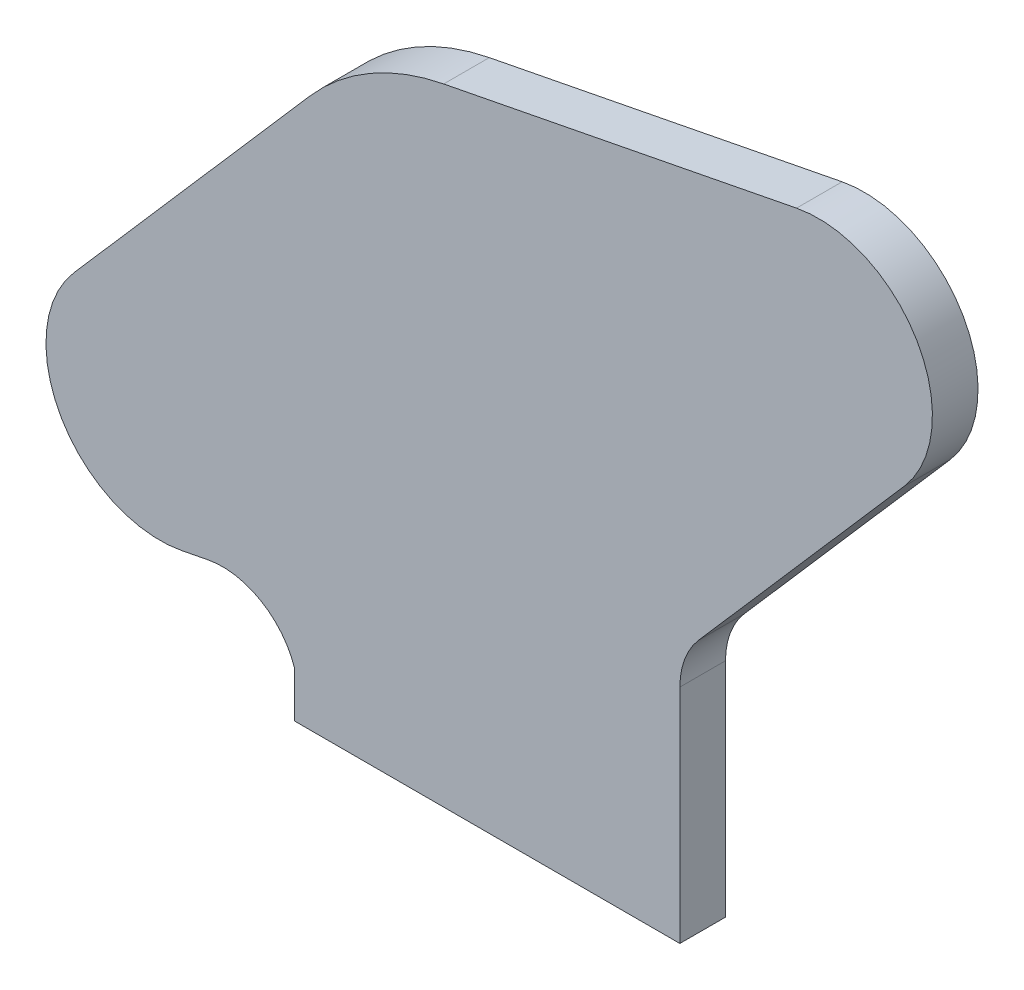
ISO-10303-21;
HEADER;
FILE_DESCRIPTION(('STEP AP214'),'2;1');
FILE_NAME('part.step','',(''),(''),'','','');
FILE_SCHEMA(('AUTOMOTIVE_DESIGN { 1 0 10303 214 1 1 1 1 }'));
ENDSEC;
DATA;
#1=APPLICATION_CONTEXT('core data for automotive mechanical design processes');
#2=APPLICATION_PROTOCOL_DEFINITION('international standard','automotive_design',2000,#1);
#3=PRODUCT_CONTEXT('',#1,'mechanical');
#4=PRODUCT('Part','Part','',(#3));
#5=PRODUCT_RELATED_PRODUCT_CATEGORY('part','',(#4));
#6=PRODUCT_DEFINITION_FORMATION('','',#4);
#7=PRODUCT_DEFINITION_CONTEXT('part definition',#1,'design');
#8=PRODUCT_DEFINITION('design','',#6,#7);
#9=PRODUCT_DEFINITION_SHAPE('','',#8);
#10=(LENGTH_UNIT() NAMED_UNIT(*) SI_UNIT(.MILLI.,.METRE.));
#11=(NAMED_UNIT(*) PLANE_ANGLE_UNIT() SI_UNIT($,.RADIAN.));
#12=(NAMED_UNIT(*) SI_UNIT($,.STERADIAN.) SOLID_ANGLE_UNIT());
#13=UNCERTAINTY_MEASURE_WITH_UNIT(LENGTH_MEASURE(1.E-05),#10,'distance_accuracy_value','');
#14=(GEOMETRIC_REPRESENTATION_CONTEXT(3) GLOBAL_UNCERTAINTY_ASSIGNED_CONTEXT((#13)) GLOBAL_UNIT_ASSIGNED_CONTEXT((#10,
#11,#12)) REPRESENTATION_CONTEXT('',''));
#15=CARTESIAN_POINT('',(0.,0.,0.));
#16=DIRECTION('',(0.,0.,1.));
#17=DIRECTION('',(1.,0.,0.));
#18=AXIS2_PLACEMENT_3D('',#15,#16,#17);
#19=CARTESIAN_POINT('',(-11.1379,-15.5152607731236,2.667));
#20=DIRECTION('',(0.,0.,-1.));
#21=DIRECTION('',(-1.,0.,0.));
#22=AXIS2_PLACEMENT_3D('',#19,#20,#21);
#23=CYLINDRICAL_SURFACE('',#22,3.175);
#24=CARTESIAN_POINT('',(-11.1379,-15.5152607731236,0.762));
#25=DIRECTION('',(0.,0.,-1.));
#26=DIRECTION('',(1.,0.,0.));
#27=AXIS2_PLACEMENT_3D('',#24,#25,#26);
#28=CIRCLE('',#27,3.175);
#29=CARTESIAN_POINT('',(-11.7462500360979,-12.3990876018156,0.762));
#30=VERTEX_POINT('',#29);
#31=CARTESIAN_POINT('',(-8.1242140924358,-14.5161,0.762));
#32=VERTEX_POINT('',#31);
#33=EDGE_CURVE('E153',#30,#32,#28,.T.);
#34=ORIENTED_EDGE('',*,*,#33,.T.);
#35=DIRECTION('',(0.,0.,-1.));
#36=VECTOR('',#35,1.);
#37=CARTESIAN_POINT('',(-8.1242140924358,-14.5161,2.667));
#38=LINE('',#37,#36);
#39=CARTESIAN_POINT('',(-8.1242140924358,-14.5161,2.667));
#40=VERTEX_POINT('',#39);
#41=EDGE_CURVE('E11',#40,#32,#38,.T.);
#42=ORIENTED_EDGE('',*,*,#41,.F.);
#43=CARTESIAN_POINT('',(-11.1379,-15.5152607731236,2.667));
#44=DIRECTION('',(0.,0.,-1.));
#45=DIRECTION('',(1.,0.,0.));
#46=AXIS2_PLACEMENT_3D('',#43,#44,#45);
#47=CIRCLE('',#46,3.175);
#48=CARTESIAN_POINT('',(-11.7462500360979,-12.3990876018156,2.667));
#49=VERTEX_POINT('',#48);
#50=EDGE_CURVE('E176',#49,#40,#47,.T.);
#51=ORIENTED_EDGE('',*,*,#50,.F.);
#52=DIRECTION('',(0.,0.,-1.));
#53=VECTOR('',#52,1.);
#54=CARTESIAN_POINT('',(-11.7462500360979,-12.3990876018156,2.667));
#55=LINE('',#54,#53);
#56=EDGE_CURVE('E149',#49,#30,#55,.T.);
#57=ORIENTED_EDGE('',*,*,#56,.T.);
#58=EDGE_LOOP('',(#34,#42,#51,#57));
#59=FACE_BOUND('',#58,.T.);
#60=ADVANCED_FACE('F33',(#59),#23,.F.);
#61=CARTESIAN_POINT('',(-8.1242140924358,-14.5161,2.667));
#62=DIRECTION('',(1.,0.,0.));
#63=DIRECTION('',(0.,1.,0.));
#64=AXIS2_PLACEMENT_3D('',#61,#62,#63);
#65=PLANE('',#64);
#66=DIRECTION('',(0.,-1.,0.));
#67=VECTOR('',#66,1.);
#68=CARTESIAN_POINT('',(-8.1242140924358,-14.5161,0.762));
#69=LINE('',#68,#67);
#70=CARTESIAN_POINT('',(-8.12421409243581,-16.4211,0.762));
#71=VERTEX_POINT('',#70);
#72=EDGE_CURVE('E156',#32,#71,#69,.T.);
#73=ORIENTED_EDGE('',*,*,#72,.T.);
#74=DIRECTION('',(0.,0.,-1.));
#75=VECTOR('',#74,1.);
#76=CARTESIAN_POINT('',(-8.12421409243581,-16.4211,2.667));
#77=LINE('',#76,#75);
#78=CARTESIAN_POINT('',(-8.12421409243581,-16.4211,2.667));
#79=VERTEX_POINT('',#78);
#80=EDGE_CURVE('E41',#79,#71,#77,.T.);
#81=ORIENTED_EDGE('',*,*,#80,.F.);
#82=DIRECTION('',(0.,-1.,0.));
#83=VECTOR('',#82,1.);
#84=CARTESIAN_POINT('',(-8.1242140924358,-14.5161,2.667));
#85=LINE('',#84,#83);
#86=EDGE_CURVE('E104',#40,#79,#85,.T.);
#87=ORIENTED_EDGE('',*,*,#86,.F.);
#88=ORIENTED_EDGE('',*,*,#41,.T.);
#89=EDGE_LOOP('',(#73,#81,#87,#88));
#90=FACE_BOUND('',#89,.T.);
#91=ADVANCED_FACE('F203',(#90),#65,.F.);
#92=CARTESIAN_POINT('',(6.3754,-16.4211,2.667));
#93=DIRECTION('',(0.,1.,0.));
#94=DIRECTION('',(0.,0.,1.));
#95=AXIS2_PLACEMENT_3D('',#92,#93,#94);
#96=PLANE('',#95);
#97=DIRECTION('',(1.,0.,0.));
#98=VECTOR('',#97,1.);
#99=CARTESIAN_POINT('',(6.3754,-16.4211,0.762));
#100=LINE('',#99,#98);
#101=CARTESIAN_POINT('',(7.9629,-16.4211,0.762));
#102=VERTEX_POINT('',#101);
#103=EDGE_CURVE('E159',#71,#102,#100,.T.);
#104=ORIENTED_EDGE('',*,*,#103,.T.);
#105=DIRECTION('',(0.,0.,-1.));
#106=VECTOR('',#105,1.);
#107=CARTESIAN_POINT('',(7.9629,-16.4211,2.667));
#108=LINE('',#107,#106);
#109=CARTESIAN_POINT('',(7.9629,-16.4211,2.667));
#110=VERTEX_POINT('',#109);
#111=EDGE_CURVE('E195',#110,#102,#108,.T.);
#112=ORIENTED_EDGE('',*,*,#111,.F.);
#113=DIRECTION('',(1.,0.,0.));
#114=VECTOR('',#113,1.);
#115=CARTESIAN_POINT('',(-8.12421409243581,-16.4211,2.667));
#116=LINE('',#115,#114);
#117=EDGE_CURVE('E202',#79,#110,#116,.T.);
#118=ORIENTED_EDGE('',*,*,#117,.F.);
#119=ORIENTED_EDGE('',*,*,#80,.T.);
#120=EDGE_LOOP('',(#104,#112,#118,#119));
#121=FACE_BOUND('',#120,.T.);
#122=ADVANCED_FACE('F200',(#121),#96,.F.);
#123=CARTESIAN_POINT('',(7.9629,-16.4211,2.667));
#124=DIRECTION('',(-1.,0.,0.));
#125=DIRECTION('',(0.,-1.,0.));
#126=AXIS2_PLACEMENT_3D('',#123,#124,#125);
#127=PLANE('',#126);
#128=DIRECTION('',(0.,1.,0.));
#129=VECTOR('',#128,1.);
#130=CARTESIAN_POINT('',(7.9629,-16.4211,0.762));
#131=LINE('',#130,#129);
#132=CARTESIAN_POINT('',(7.9629,-7.14779904744405,0.762));
#133=VERTEX_POINT('',#132);
#134=EDGE_CURVE('E161',#102,#133,#131,.T.);
#135=ORIENTED_EDGE('',*,*,#134,.T.);
#136=DIRECTION('',(0.,0.,-1.));
#137=VECTOR('',#136,1.);
#138=CARTESIAN_POINT('',(7.9629,-7.14779904744405,2.667));
#139=LINE('',#138,#137);
#140=CARTESIAN_POINT('',(7.9629,-7.14779904744405,2.667));
#141=VERTEX_POINT('',#140);
#142=EDGE_CURVE('E192',#141,#133,#139,.T.);
#143=ORIENTED_EDGE('',*,*,#142,.F.);
#144=DIRECTION('',(0.,1.,0.));
#145=VECTOR('',#144,1.);
#146=CARTESIAN_POINT('',(7.9629,-16.4211,2.667));
#147=LINE('',#146,#145);
#148=EDGE_CURVE('E222',#110,#141,#147,.T.);
#149=ORIENTED_EDGE('',*,*,#148,.F.);
#150=ORIENTED_EDGE('',*,*,#111,.T.);
#151=EDGE_LOOP('',(#135,#143,#149,#150));
#152=FACE_BOUND('',#151,.T.);
#153=ADVANCED_FACE('F213',(#152),#127,.F.);
#154=CARTESIAN_POINT('',(11.1379,-7.14779904744405,2.667));
#155=DIRECTION('',(0.,0.,-1.));
#156=DIRECTION('',(-1.,0.,0.));
#157=AXIS2_PLACEMENT_3D('',#154,#155,#156);
#158=CYLINDRICAL_SURFACE('',#157,3.175);
#159=CARTESIAN_POINT('',(11.1379,-7.14779904744405,0.762));
#160=DIRECTION('',(0.,0.,-1.));
#161=DIRECTION('',(1.,0.,0.));
#162=AXIS2_PLACEMENT_3D('',#159,#160,#161);
#163=CIRCLE('',#162,3.175);
#164=CARTESIAN_POINT('',(8.74338988910475,-5.06286587613606,0.762));
#165=VERTEX_POINT('',#164);
#166=EDGE_CURVE('E163',#133,#165,#163,.T.);
#167=ORIENTED_EDGE('',*,*,#166,.T.);
#168=DIRECTION('',(0.,0.,-1.));
#169=VECTOR('',#168,1.);
#170=CARTESIAN_POINT('',(8.74338988910475,-5.06286587613606,2.667));
#171=LINE('',#170,#169);
#172=CARTESIAN_POINT('',(8.74338988910475,-5.06286587613606,2.667));
#173=VERTEX_POINT('',#172);
#174=EDGE_CURVE('E189',#173,#165,#171,.T.);
#175=ORIENTED_EDGE('',*,*,#174,.F.);
#176=CARTESIAN_POINT('',(11.1379,-7.14779904744405,2.667));
#177=DIRECTION('',(0.,0.,-1.));
#178=DIRECTION('',(1.,0.,0.));
#179=AXIS2_PLACEMENT_3D('',#176,#177,#178);
#180=CIRCLE('',#179,3.175);
#181=EDGE_CURVE('E219',#141,#173,#180,.T.);
#182=ORIENTED_EDGE('',*,*,#181,.F.);
#183=ORIENTED_EDGE('',*,*,#142,.T.);
#184=EDGE_LOOP('',(#167,#175,#182,#183));
#185=FACE_BOUND('',#184,.T.);
#186=ADVANCED_FACE('F217',(#185),#158,.F.);
#187=CARTESIAN_POINT('',(8.74338988910475,-5.06286587613606,2.667));
#188=DIRECTION('',(-0.754176412880396,0.656671864978894,0.));
#189=DIRECTION('',(-0.656671864978894,-0.754176412880396,0.));
#190=AXIS2_PLACEMENT_3D('',#187,#188,#189);
#191=PLANE('',#190);
#192=DIRECTION('',(0.656671864978894,0.754176412880396,0.));
#193=VECTOR('',#192,1.);
#194=CARTESIAN_POINT('',(8.74338988910475,-5.06286587613606,0.762));
#195=LINE('',#194,#193);
#196=CARTESIAN_POINT('',(17.3399184514209,4.81010024303796,0.762));
#197=VERTEX_POINT('',#196);
#198=EDGE_CURVE('E165',#165,#197,#195,.T.);
#199=ORIENTED_EDGE('',*,*,#198,.T.);
#200=DIRECTION('',(0.,0.,-1.));
#201=VECTOR('',#200,1.);
#202=CARTESIAN_POINT('',(17.3399184514209,4.81010024303796,2.667));
#203=LINE('',#202,#201);
#204=CARTESIAN_POINT('',(17.3399184514209,4.81010024303796,2.667));
#205=VERTEX_POINT('',#204);
#206=EDGE_CURVE('E186',#205,#197,#203,.T.);
#207=ORIENTED_EDGE('',*,*,#206,.F.);
#208=DIRECTION('',(0.656671864978894,0.754176412880396,0.));
#209=VECTOR('',#208,1.);
#210=CARTESIAN_POINT('',(8.74338988910475,-5.06286587613606,2.667));
#211=LINE('',#210,#209);
#212=EDGE_CURVE('E221',#173,#205,#211,.T.);
#213=ORIENTED_EDGE('',*,*,#212,.F.);
#214=ORIENTED_EDGE('',*,*,#174,.T.);
#215=EDGE_LOOP('',(#199,#207,#213,#214));
#216=FACE_BOUND('',#215,.T.);
#217=ADVANCED_FACE('F246',(#216),#191,.F.);
#218=CARTESIAN_POINT('',(13.748153285078,7.9375,2.667));
#219=DIRECTION('',(0.,0.,-1.));
#220=DIRECTION('',(-1.,0.,0.));
#221=AXIS2_PLACEMENT_3D('',#218,#219,#220);
#222=CYLINDRICAL_SURFACE('',#221,4.7625);
#223=CARTESIAN_POINT('',(13.748153285078,7.9375,0.762));
#224=DIRECTION('',(0.,0.,1.));
#225=DIRECTION('',(1.,0.,0.));
#226=AXIS2_PLACEMENT_3D('',#223,#224,#225);
#227=CIRCLE('',#226,4.7625);
#228=CARTESIAN_POINT('',(12.8356282309311,12.611759756962,0.762));
#229=VERTEX_POINT('',#228);
#230=EDGE_CURVE('E167',#197,#229,#227,.T.);
#231=ORIENTED_EDGE('',*,*,#230,.T.);
#232=DIRECTION('',(0.,0.,-1.));
#233=VECTOR('',#232,1.);
#234=CARTESIAN_POINT('',(12.8356282309311,12.611759756962,2.667));
#235=LINE('',#234,#233);
#236=CARTESIAN_POINT('',(12.8356282309311,12.611759756962,2.667));
#237=VERTEX_POINT('',#236);
#238=EDGE_CURVE('E183',#237,#229,#235,.T.);
#239=ORIENTED_EDGE('',*,*,#238,.F.);
#240=CARTESIAN_POINT('',(13.748153285078,7.9375,2.667));
#241=DIRECTION('',(0.,0.,1.));
#242=DIRECTION('',(1.,0.,0.));
#243=AXIS2_PLACEMENT_3D('',#240,#241,#242);
#244=CIRCLE('',#243,4.7625);
#245=EDGE_CURVE('E224',#205,#237,#244,.T.);
#246=ORIENTED_EDGE('',*,*,#245,.F.);
#247=ORIENTED_EDGE('',*,*,#206,.T.);
#248=EDGE_LOOP('',(#231,#239,#246,#247));
#249=FACE_BOUND('',#248,.T.);
#250=ADVANCED_FACE('F243',(#249),#222,.T.);
#251=CARTESIAN_POINT('',(12.8356282309311,12.611759756962,2.667));
#252=DIRECTION('',(0.191606310582025,-0.981471864978892,0.));
#253=DIRECTION('',(0.981471864978892,0.191606310582025,0.));
#254=AXIS2_PLACEMENT_3D('',#251,#252,#253);
#255=PLANE('',#254);
#256=DIRECTION('',(-0.981471864978892,-0.191606310582025,0.));
#257=VECTOR('',#256,1.);
#258=CARTESIAN_POINT('',(12.8356282309311,12.611759756962,0.762));
#259=LINE('',#258,#257);
#260=CARTESIAN_POINT('',(-1.90048551276989,9.73492498716615,0.762));
#261=VERTEX_POINT('',#260);
#262=EDGE_CURVE('E169',#229,#261,#259,.T.);
#263=ORIENTED_EDGE('',*,*,#262,.T.);
#264=DIRECTION('',(0.,0.,-1.));
#265=VECTOR('',#264,1.);
#266=CARTESIAN_POINT('',(-1.90048551276989,9.73492498716615,2.667));
#267=LINE('',#266,#265);
#268=CARTESIAN_POINT('',(-1.90048551276989,9.73492498716615,2.667));
#269=VERTEX_POINT('',#268);
#270=EDGE_CURVE('E180',#269,#261,#267,.T.);
#271=ORIENTED_EDGE('',*,*,#270,.F.);
#272=DIRECTION('',(-0.981471864978892,-0.191606310582025,0.));
#273=VECTOR('',#272,1.);
#274=CARTESIAN_POINT('',(12.8356282309311,12.611759756962,2.667));
#275=LINE('',#274,#273);
#276=EDGE_CURVE('E230',#237,#269,#275,.T.);
#277=ORIENTED_EDGE('',*,*,#276,.F.);
#278=ORIENTED_EDGE('',*,*,#238,.T.);
#279=EDGE_LOOP('',(#263,#271,#277,#278));
#280=FACE_BOUND('',#279,.T.);
#281=ADVANCED_FACE('F236',(#280),#255,.F.);
#282=CARTESIAN_POINT('',(0.,0.,2.667));
#283=DIRECTION('',(0.,0.,-1.));
#284=DIRECTION('',(-1.,0.,0.));
#285=AXIS2_PLACEMENT_3D('',#282,#283,#284);
#286=CYLINDRICAL_SURFACE('',#285,9.9187);
#287=CARTESIAN_POINT('',(0.,0.,0.762));
#288=DIRECTION('',(0.,0.,1.));
#289=DIRECTION('',(1.,0.,0.));
#290=AXIS2_PLACEMENT_3D('',#287,#288,#289);
#291=CIRCLE('',#290,9.9187);
#292=CARTESIAN_POINT('',(-7.48044958643676,6.51333122716618,0.762));
#293=VERTEX_POINT('',#292);
#294=EDGE_CURVE('E171',#261,#293,#291,.T.);
#295=ORIENTED_EDGE('',*,*,#294,.T.);
#296=DIRECTION('',(0.,0.,-1.));
#297=VECTOR('',#296,1.);
#298=CARTESIAN_POINT('',(-7.48044958643676,6.51333122716618,2.667));
#299=LINE('',#298,#297);
#300=CARTESIAN_POINT('',(-7.48044958643676,6.51333122716618,2.667));
#301=VERTEX_POINT('',#300);
#302=EDGE_CURVE('E144',#301,#293,#299,.T.);
#303=ORIENTED_EDGE('',*,*,#302,.F.);
#304=CARTESIAN_POINT('',(0.,0.,2.667));
#305=DIRECTION('',(0.,0.,1.));
#306=DIRECTION('',(1.,0.,0.));
#307=AXIS2_PLACEMENT_3D('',#304,#305,#306);
#308=CIRCLE('',#307,9.9187);
#309=EDGE_CURVE('E135',#269,#301,#308,.T.);
#310=ORIENTED_EDGE('',*,*,#309,.F.);
#311=ORIENTED_EDGE('',*,*,#270,.T.);
#312=EDGE_LOOP('',(#295,#303,#310,#311));
#313=FACE_BOUND('',#312,.T.);
#314=ADVANCED_FACE('F240',(#313),#286,.T.);
#315=CARTESIAN_POINT('',(-7.48044958643676,6.51333122716618,2.667));
#316=DIRECTION('',(0.754176412880396,-0.656671864978893,0.));
#317=DIRECTION('',(0.656671864978893,0.754176412880397,0.));
#318=AXIS2_PLACEMENT_3D('',#315,#316,#317);
#319=PLANE('',#318);
#320=DIRECTION('',(-0.656671864978893,-0.754176412880396,0.));
#321=VECTOR('',#320,1.);
#322=CARTESIAN_POINT('',(-7.48044958643676,6.51333122716618,0.762));
#323=LINE('',#322,#321);
#324=CARTESIAN_POINT('',(-17.3399184514208,-4.81010024303797,0.762));
#325=VERTEX_POINT('',#324);
#326=EDGE_CURVE('E143',#293,#325,#323,.T.);
#327=ORIENTED_EDGE('',*,*,#326,.T.);
#328=DIRECTION('',(0.,0.,-1.));
#329=VECTOR('',#328,1.);
#330=CARTESIAN_POINT('',(-17.3399184514208,-4.81010024303797,2.667));
#331=LINE('',#330,#329);
#332=CARTESIAN_POINT('',(-17.3399184514208,-4.81010024303797,2.667));
#333=VERTEX_POINT('',#332);
#334=EDGE_CURVE('E140',#333,#325,#331,.T.);
#335=ORIENTED_EDGE('',*,*,#334,.F.);
#336=DIRECTION('',(-0.656671864978893,-0.754176412880396,0.));
#337=VECTOR('',#336,1.);
#338=CARTESIAN_POINT('',(-7.48044958643676,6.51333122716618,2.667));
#339=LINE('',#338,#337);
#340=EDGE_CURVE('E129',#301,#333,#339,.T.);
#341=ORIENTED_EDGE('',*,*,#340,.F.);
#342=ORIENTED_EDGE('',*,*,#302,.T.);
#343=EDGE_LOOP('',(#327,#335,#341,#342));
#344=FACE_BOUND('',#343,.T.);
#345=ADVANCED_FACE('F141',(#344),#319,.F.);
#346=CARTESIAN_POINT('',(-13.748153285078,-7.9375,2.667));
#347=DIRECTION('',(0.,0.,-1.));
#348=DIRECTION('',(-1.,0.,0.));
#349=AXIS2_PLACEMENT_3D('',#346,#347,#348);
#350=CYLINDRICAL_SURFACE('',#349,4.7625);
#351=CARTESIAN_POINT('',(-13.748153285078,-7.9375,0.762));
#352=DIRECTION('',(0.,0.,1.));
#353=DIRECTION('',(1.,0.,0.));
#354=AXIS2_PLACEMENT_3D('',#351,#352,#353);
#355=CIRCLE('',#354,4.7625);
#356=CARTESIAN_POINT('',(-12.8356282309311,-12.611759756962,0.762));
#357=VERTEX_POINT('',#356);
#358=EDGE_CURVE('E90',#325,#357,#355,.T.);
#359=ORIENTED_EDGE('',*,*,#358,.T.);
#360=DIRECTION('',(0.,0.,-1.));
#361=VECTOR('',#360,1.);
#362=CARTESIAN_POINT('',(-12.8356282309311,-12.611759756962,2.667));
#363=LINE('',#362,#361);
#364=CARTESIAN_POINT('',(-12.8356282309311,-12.611759756962,2.667));
#365=VERTEX_POINT('',#364);
#366=EDGE_CURVE('E145',#365,#357,#363,.T.);
#367=ORIENTED_EDGE('',*,*,#366,.F.);
#368=CARTESIAN_POINT('',(-13.748153285078,-7.9375,2.667));
#369=DIRECTION('',(0.,0.,1.));
#370=DIRECTION('',(1.,0.,0.));
#371=AXIS2_PLACEMENT_3D('',#368,#369,#370);
#372=CIRCLE('',#371,4.7625);
#373=EDGE_CURVE('E133',#333,#365,#372,.T.);
#374=ORIENTED_EDGE('',*,*,#373,.F.);
#375=ORIENTED_EDGE('',*,*,#334,.T.);
#376=EDGE_LOOP('',(#359,#367,#374,#375));
#377=FACE_BOUND('',#376,.T.);
#378=ADVANCED_FACE('F147',(#377),#350,.T.);
#379=CARTESIAN_POINT('',(-12.8356282309311,-12.611759756962,2.667));
#380=DIRECTION('',(-0.191606310582088,0.98147186497888,0.));
#381=DIRECTION('',(-0.98147186497888,-0.191606310582088,0.));
#382=AXIS2_PLACEMENT_3D('',#379,#380,#381);
#383=PLANE('',#382);
#384=DIRECTION('',(0.98147186497888,0.191606310582088,0.));
#385=VECTOR('',#384,1.);
#386=CARTESIAN_POINT('',(-12.8356282309311,-12.611759756962,0.762));
#387=LINE('',#386,#385);
#388=EDGE_CURVE('E96',#357,#30,#387,.T.);
#389=ORIENTED_EDGE('',*,*,#388,.T.);
#390=ORIENTED_EDGE('',*,*,#56,.F.);
#391=DIRECTION('',(0.98147186497888,0.191606310582088,0.));
#392=VECTOR('',#391,1.);
#393=CARTESIAN_POINT('',(-12.8356282309311,-12.611759756962,2.667));
#394=LINE('',#393,#392);
#395=EDGE_CURVE('E49',#365,#49,#394,.T.);
#396=ORIENTED_EDGE('',*,*,#395,.F.);
#397=ORIENTED_EDGE('',*,*,#366,.T.);
#398=EDGE_LOOP('',(#389,#390,#396,#397));
#399=FACE_BOUND('',#398,.T.);
#400=ADVANCED_FACE('F261',(#399),#383,.F.);
#401=CARTESIAN_POINT('',(-11.1379,-15.5152607731236,2.667));
#402=DIRECTION('',(0.,0.,1.));
#403=DIRECTION('',(1.,0.,0.));
#404=AXIS2_PLACEMENT_3D('',#401,#402,#403);
#405=PLANE('',#404);
#406=ORIENTED_EDGE('',*,*,#50,.T.);
#407=ORIENTED_EDGE('',*,*,#86,.T.);
#408=ORIENTED_EDGE('',*,*,#117,.T.);
#409=ORIENTED_EDGE('',*,*,#148,.T.);
#410=ORIENTED_EDGE('',*,*,#181,.T.);
#411=ORIENTED_EDGE('',*,*,#212,.T.);
#412=ORIENTED_EDGE('',*,*,#245,.T.);
#413=ORIENTED_EDGE('',*,*,#276,.T.);
#414=ORIENTED_EDGE('',*,*,#309,.T.);
#415=ORIENTED_EDGE('',*,*,#340,.T.);
#416=ORIENTED_EDGE('',*,*,#373,.T.);
#417=ORIENTED_EDGE('',*,*,#395,.T.);
#418=EDGE_LOOP('',(#406,#407,#408,#409,#410,#411,#412,#413,#414,#415,#416,#417));
#419=FACE_BOUND('',#418,.T.);
#420=ADVANCED_FACE('F131',(#419),#405,.T.);
#421=CARTESIAN_POINT('',(-11.1379,-15.5152607731236,0.762));
#422=DIRECTION('',(0.,0.,1.));
#423=DIRECTION('',(1.,0.,0.));
#424=AXIS2_PLACEMENT_3D('',#421,#422,#423);
#425=PLANE('',#424);
#426=ORIENTED_EDGE('',*,*,#33,.F.);
#427=ORIENTED_EDGE('',*,*,#388,.F.);
#428=ORIENTED_EDGE('',*,*,#358,.F.);
#429=ORIENTED_EDGE('',*,*,#326,.F.);
#430=ORIENTED_EDGE('',*,*,#294,.F.);
#431=ORIENTED_EDGE('',*,*,#262,.F.);
#432=ORIENTED_EDGE('',*,*,#230,.F.);
#433=ORIENTED_EDGE('',*,*,#198,.F.);
#434=ORIENTED_EDGE('',*,*,#166,.F.);
#435=ORIENTED_EDGE('',*,*,#134,.F.);
#436=ORIENTED_EDGE('',*,*,#103,.F.);
#437=ORIENTED_EDGE('',*,*,#72,.F.);
#438=EDGE_LOOP('',(#426,#427,#428,#429,#430,#431,#432,#433,#434,#435,#436,#437));
#439=FACE_BOUND('',#438,.T.);
#440=ADVANCED_FACE('F207',(#439),#425,.F.);
#441=CLOSED_SHELL('',(#60,#91,#122,#153,#186,#217,#250,#281,#314,#345,#378,#400,#420,#440));
#442=MANIFOLD_SOLID_BREP('B2',#441);
#443=ADVANCED_BREP_SHAPE_REPRESENTATION('',(#18,#442),#14);
#444=SHAPE_DEFINITION_REPRESENTATION(#9,#443);
ENDSEC;
END-ISO-10303-21;
